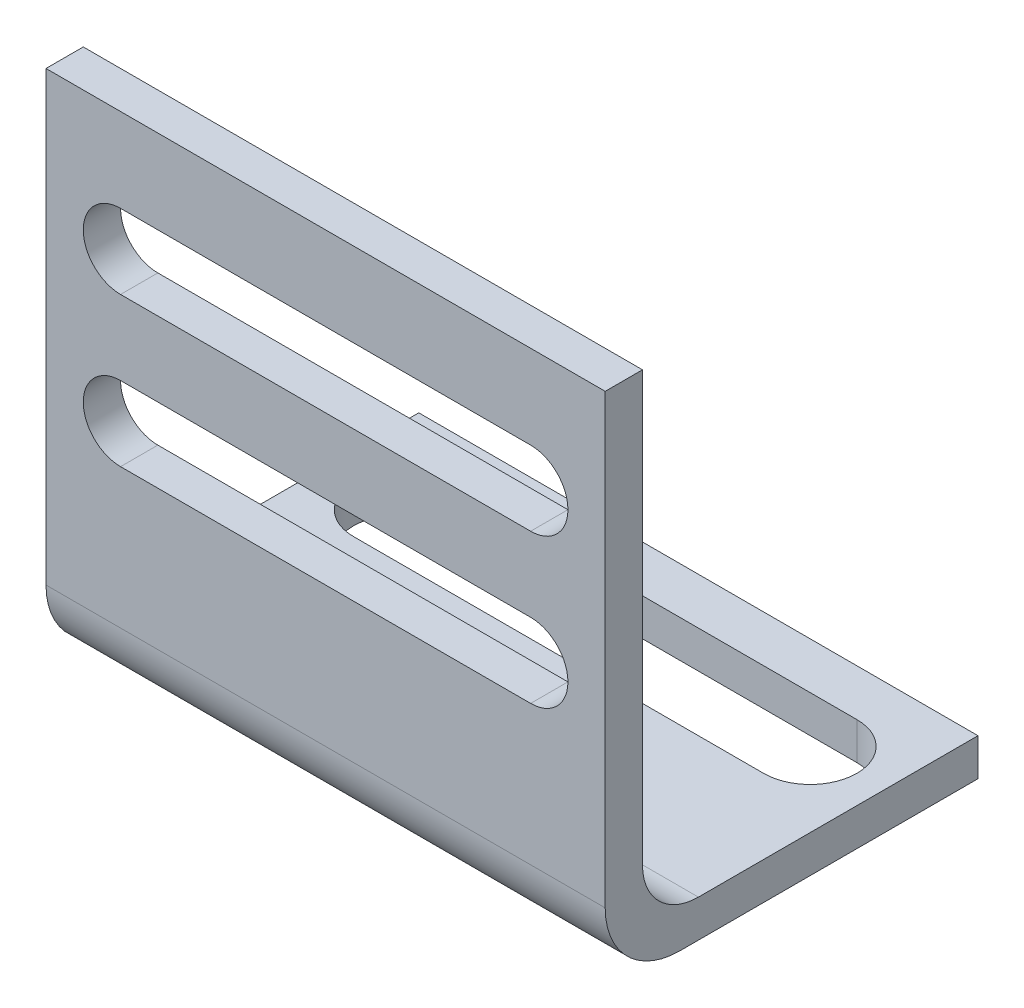
ISO-10303-21;
HEADER;
FILE_DESCRIPTION(('STEP AP214'),'2;1');
FILE_NAME('part.step','',(''),(''),'','','');
FILE_SCHEMA(('AUTOMOTIVE_DESIGN { 1 0 10303 214 1 1 1 1 }'));
ENDSEC;
DATA;
#1=APPLICATION_CONTEXT('core data for automotive mechanical design processes');
#2=APPLICATION_PROTOCOL_DEFINITION('international standard','automotive_design',2000,#1);
#3=PRODUCT_CONTEXT('',#1,'mechanical');
#4=PRODUCT('Part','Part','',(#3));
#5=PRODUCT_RELATED_PRODUCT_CATEGORY('part','',(#4));
#6=PRODUCT_DEFINITION_FORMATION('','',#4);
#7=PRODUCT_DEFINITION_CONTEXT('part definition',#1,'design');
#8=PRODUCT_DEFINITION('design','',#6,#7);
#9=PRODUCT_DEFINITION_SHAPE('','',#8);
#10=(LENGTH_UNIT() NAMED_UNIT(*) SI_UNIT(.MILLI.,.METRE.));
#11=(NAMED_UNIT(*) PLANE_ANGLE_UNIT() SI_UNIT($,.RADIAN.));
#12=(NAMED_UNIT(*) SI_UNIT($,.STERADIAN.) SOLID_ANGLE_UNIT());
#13=UNCERTAINTY_MEASURE_WITH_UNIT(LENGTH_MEASURE(1.E-05),#10,'distance_accuracy_value','');
#14=(GEOMETRIC_REPRESENTATION_CONTEXT(3) GLOBAL_UNCERTAINTY_ASSIGNED_CONTEXT((#13)) GLOBAL_UNIT_ASSIGNED_CONTEXT((#10,
#11,#12)) REPRESENTATION_CONTEXT('',''));
#15=CARTESIAN_POINT('',(0.,0.,0.));
#16=DIRECTION('',(0.,0.,1.));
#17=DIRECTION('',(1.,0.,0.));
#18=AXIS2_PLACEMENT_3D('',#15,#16,#17);
#19=CARTESIAN_POINT('',(30.,0.,0.));
#20=DIRECTION('',(0.,-1.,0.));
#21=DIRECTION('',(0.,0.,-1.));
#22=AXIS2_PLACEMENT_3D('',#19,#20,#21);
#23=PLANE('',#22);
#24=DIRECTION('',(0.,0.,1.));
#25=VECTOR('',#24,1.);
#26=CARTESIAN_POINT('',(0.,0.,0.));
#27=LINE('',#26,#25);
#28=CARTESIAN_POINT('',(0.,0.,-2.));
#29=VERTEX_POINT('',#28);
#30=CARTESIAN_POINT('',(0.,0.,0.));
#31=VERTEX_POINT('',#30);
#32=EDGE_CURVE('E239',#29,#31,#27,.T.);
#33=ORIENTED_EDGE('',*,*,#32,.T.);
#34=DIRECTION('',(-1.,0.,0.));
#35=VECTOR('',#34,1.);
#36=CARTESIAN_POINT('',(30.,0.,0.));
#37=LINE('',#36,#35);
#38=CARTESIAN_POINT('',(30.,0.,0.));
#39=VERTEX_POINT('',#38);
#40=EDGE_CURVE('E327',#39,#31,#37,.T.);
#41=ORIENTED_EDGE('',*,*,#40,.F.);
#42=DIRECTION('',(0.,0.,1.));
#43=VECTOR('',#42,1.);
#44=CARTESIAN_POINT('',(30.,0.,0.));
#45=LINE('',#44,#43);
#46=CARTESIAN_POINT('',(30.,0.,-2.));
#47=VERTEX_POINT('',#46);
#48=EDGE_CURVE('E275',#47,#39,#45,.T.);
#49=ORIENTED_EDGE('',*,*,#48,.F.);
#50=DIRECTION('',(-1.,0.,0.));
#51=VECTOR('',#50,1.);
#52=CARTESIAN_POINT('',(30.,0.,-2.));
#53=LINE('',#52,#51);
#54=EDGE_CURVE('E296',#47,#29,#53,.T.);
#55=ORIENTED_EDGE('',*,*,#54,.T.);
#56=EDGE_LOOP('',(#33,#41,#49,#55));
#57=FACE_BOUND('',#56,.T.);
#58=ADVANCED_FACE('F39',(#57),#23,.F.);
#59=CARTESIAN_POINT('',(30.,-17.4575433975545,0.));
#60=DIRECTION('',(0.,0.,-1.));
#61=DIRECTION('',(0.,1.,0.));
#62=AXIS2_PLACEMENT_3D('',#59,#60,#61);
#63=PLANE('',#62);
#64=DIRECTION('',(1.,0.,0.));
#65=VECTOR('',#64,1.);
#66=CARTESIAN_POINT('',(4.,-16.5,0.));
#67=LINE('',#66,#65);
#68=CARTESIAN_POINT('',(4.,-16.5,0.));
#69=VERTEX_POINT('',#68);
#70=CARTESIAN_POINT('',(26.,-16.5,0.));
#71=VERTEX_POINT('',#70);
#72=EDGE_CURVE('E222',#69,#71,#67,.T.);
#73=ORIENTED_EDGE('',*,*,#72,.F.);
#74=CARTESIAN_POINT('',(4.,-14.5,0.));
#75=DIRECTION('',(0.,0.,1.));
#76=DIRECTION('',(1.,0.,0.));
#77=AXIS2_PLACEMENT_3D('',#74,#75,#76);
#78=CIRCLE('',#77,2.);
#79=CARTESIAN_POINT('',(4.,-12.5,0.));
#80=VERTEX_POINT('',#79);
#81=EDGE_CURVE('E219',#80,#69,#78,.T.);
#82=ORIENTED_EDGE('',*,*,#81,.F.);
#83=DIRECTION('',(-1.,0.,0.));
#84=VECTOR('',#83,1.);
#85=CARTESIAN_POINT('',(4.,-12.5,0.));
#86=LINE('',#85,#84);
#87=CARTESIAN_POINT('',(26.,-12.5,0.));
#88=VERTEX_POINT('',#87);
#89=EDGE_CURVE('E231',#88,#80,#86,.T.);
#90=ORIENTED_EDGE('',*,*,#89,.F.);
#91=CARTESIAN_POINT('',(26.,-14.5,0.));
#92=DIRECTION('',(0.,0.,1.));
#93=DIRECTION('',(1.,0.,0.));
#94=AXIS2_PLACEMENT_3D('',#91,#92,#93);
#95=CIRCLE('',#94,2.);
#96=EDGE_CURVE('E227',#71,#88,#95,.T.);
#97=ORIENTED_EDGE('',*,*,#96,.F.);
#98=EDGE_LOOP('',(#73,#82,#90,#97));
#99=FACE_BOUND('',#98,.T.);
#100=DIRECTION('',(1.,0.,0.));
#101=VECTOR('',#100,1.);
#102=CARTESIAN_POINT('',(4.,-8.5,0.));
#103=LINE('',#102,#101);
#104=CARTESIAN_POINT('',(4.,-8.5,0.));
#105=VERTEX_POINT('',#104);
#106=CARTESIAN_POINT('',(26.,-8.5,0.));
#107=VERTEX_POINT('',#106);
#108=EDGE_CURVE('E251',#105,#107,#103,.T.);
#109=ORIENTED_EDGE('',*,*,#108,.F.);
#110=CARTESIAN_POINT('',(4.,-6.5,0.));
#111=DIRECTION('',(0.,0.,1.));
#112=DIRECTION('',(1.,0.,0.));
#113=AXIS2_PLACEMENT_3D('',#110,#111,#112);
#114=CIRCLE('',#113,2.);
#115=CARTESIAN_POINT('',(4.,-4.5,0.));
#116=VERTEX_POINT('',#115);
#117=EDGE_CURVE('E214',#116,#105,#114,.T.);
#118=ORIENTED_EDGE('',*,*,#117,.F.);
#119=DIRECTION('',(-1.,0.,0.));
#120=VECTOR('',#119,1.);
#121=CARTESIAN_POINT('',(4.,-4.5,0.));
#122=LINE('',#121,#120);
#123=CARTESIAN_POINT('',(26.,-4.5,0.));
#124=VERTEX_POINT('',#123);
#125=EDGE_CURVE('E259',#124,#116,#122,.T.);
#126=ORIENTED_EDGE('',*,*,#125,.F.);
#127=CARTESIAN_POINT('',(26.,-6.5,0.));
#128=DIRECTION('',(0.,0.,1.));
#129=DIRECTION('',(1.,0.,0.));
#130=AXIS2_PLACEMENT_3D('',#127,#128,#129);
#131=CIRCLE('',#130,2.);
#132=EDGE_CURVE('E255',#107,#124,#131,.T.);
#133=ORIENTED_EDGE('',*,*,#132,.F.);
#134=EDGE_LOOP('',(#109,#118,#126,#133));
#135=FACE_BOUND('',#134,.T.);
#136=DIRECTION('',(0.,-1.,0.));
#137=VECTOR('',#136,1.);
#138=CARTESIAN_POINT('',(0.,-17.4575433975545,0.));
#139=LINE('',#138,#137);
#140=CARTESIAN_POINT('',(0.,-24.,0.));
#141=VERTEX_POINT('',#140);
#142=EDGE_CURVE('E300',#31,#141,#139,.T.);
#143=ORIENTED_EDGE('',*,*,#142,.T.);
#144=DIRECTION('',(-1.,0.,0.));
#145=VECTOR('',#144,1.);
#146=CARTESIAN_POINT('',(30.,-24.,0.));
#147=LINE('',#146,#145);
#148=CARTESIAN_POINT('',(30.,-24.,0.));
#149=VERTEX_POINT('',#148);
#150=EDGE_CURVE('E383',#141,#149,#147,.F.);
#151=ORIENTED_EDGE('',*,*,#150,.T.);
#152=DIRECTION('',(0.,-1.,0.));
#153=VECTOR('',#152,1.);
#154=CARTESIAN_POINT('',(30.,0.,0.));
#155=LINE('',#154,#153);
#156=EDGE_CURVE('E279',#39,#149,#155,.T.);
#157=ORIENTED_EDGE('',*,*,#156,.F.);
#158=ORIENTED_EDGE('',*,*,#40,.T.);
#159=EDGE_LOOP('',(#143,#151,#157,#158));
#160=FACE_BOUND('',#159,.T.);
#161=ADVANCED_FACE('F418',(#99,#135,#160),#63,.F.);
#162=CARTESIAN_POINT('',(30.,-28.,-3.57604266858778));
#163=DIRECTION('',(0.,1.,0.));
#164=DIRECTION('',(0.,0.,1.));
#165=AXIS2_PLACEMENT_3D('',#162,#163,#164);
#166=PLANE('',#165);
#167=DIRECTION('',(1.,0.,0.));
#168=VECTOR('',#167,1.);
#169=CARTESIAN_POINT('',(4.,-28.,-17.5));
#170=LINE('',#169,#168);
#171=CARTESIAN_POINT('',(4.,-28.,-17.5));
#172=VERTEX_POINT('',#171);
#173=CARTESIAN_POINT('',(26.,-28.,-17.5));
#174=VERTEX_POINT('',#173);
#175=EDGE_CURVE('E193',#172,#174,#170,.T.);
#176=ORIENTED_EDGE('',*,*,#175,.F.);
#177=CARTESIAN_POINT('',(4.,-28.,-15.));
#178=DIRECTION('',(0.,-1.,0.));
#179=DIRECTION('',(0.,0.,-1.));
#180=AXIS2_PLACEMENT_3D('',#177,#178,#179);
#181=CIRCLE('',#180,2.5);
#182=CARTESIAN_POINT('',(4.,-28.,-12.5));
#183=VERTEX_POINT('',#182);
#184=EDGE_CURVE('E199',#183,#172,#181,.T.);
#185=ORIENTED_EDGE('',*,*,#184,.F.);
#186=DIRECTION('',(-1.,0.,0.));
#187=VECTOR('',#186,1.);
#188=CARTESIAN_POINT('',(4.,-28.,-12.5));
#189=LINE('',#188,#187);
#190=CARTESIAN_POINT('',(26.,-28.,-12.5));
#191=VERTEX_POINT('',#190);
#192=EDGE_CURVE('E204',#191,#183,#189,.T.);
#193=ORIENTED_EDGE('',*,*,#192,.F.);
#194=CARTESIAN_POINT('',(26.,-28.,-15.));
#195=DIRECTION('',(0.,-1.,0.));
#196=DIRECTION('',(0.,0.,-1.));
#197=AXIS2_PLACEMENT_3D('',#194,#195,#196);
#198=CIRCLE('',#197,2.5);
#199=EDGE_CURVE('E181',#174,#191,#198,.T.);
#200=ORIENTED_EDGE('',*,*,#199,.F.);
#201=EDGE_LOOP('',(#176,#185,#193,#200));
#202=FACE_BOUND('',#201,.T.);
#203=DIRECTION('',(0.,0.,-1.));
#204=VECTOR('',#203,1.);
#205=CARTESIAN_POINT('',(30.,-28.,0.));
#206=LINE('',#205,#204);
#207=CARTESIAN_POINT('',(30.,-28.,-4.));
#208=VERTEX_POINT('',#207);
#209=CARTESIAN_POINT('',(30.,-28.,-20.));
#210=VERTEX_POINT('',#209);
#211=EDGE_CURVE('E284',#208,#210,#206,.T.);
#212=ORIENTED_EDGE('',*,*,#211,.F.);
#213=DIRECTION('',(-1.,0.,0.));
#214=VECTOR('',#213,1.);
#215=CARTESIAN_POINT('',(30.,-28.,-4.));
#216=LINE('',#215,#214);
#217=CARTESIAN_POINT('',(0.,-28.,-4.));
#218=VERTEX_POINT('',#217);
#219=EDGE_CURVE('E376',#208,#218,#216,.T.);
#220=ORIENTED_EDGE('',*,*,#219,.T.);
#221=DIRECTION('',(0.,0.,-1.));
#222=VECTOR('',#221,1.);
#223=CARTESIAN_POINT('',(0.,-28.,-3.57604266858778));
#224=LINE('',#223,#222);
#225=CARTESIAN_POINT('',(0.,-28.,-20.));
#226=VERTEX_POINT('',#225);
#227=EDGE_CURVE('E304',#218,#226,#224,.T.);
#228=ORIENTED_EDGE('',*,*,#227,.T.);
#229=DIRECTION('',(-1.,0.,0.));
#230=VECTOR('',#229,1.);
#231=CARTESIAN_POINT('',(30.,-28.,-20.));
#232=LINE('',#231,#230);
#233=EDGE_CURVE('E323',#210,#226,#232,.T.);
#234=ORIENTED_EDGE('',*,*,#233,.F.);
#235=EDGE_LOOP('',(#212,#220,#228,#234));
#236=FACE_BOUND('',#235,.T.);
#237=ADVANCED_FACE('F201',(#202,#236),#166,.F.);
#238=CARTESIAN_POINT('',(30.,-26.,-20.));
#239=DIRECTION('',(0.,0.,1.));
#240=DIRECTION('',(1.,0.,0.));
#241=AXIS2_PLACEMENT_3D('',#238,#239,#240);
#242=PLANE('',#241);
#243=DIRECTION('',(0.,1.,0.));
#244=VECTOR('',#243,1.);
#245=CARTESIAN_POINT('',(0.,-26.,-20.));
#246=LINE('',#245,#244);
#247=CARTESIAN_POINT('',(0.,-26.,-20.));
#248=VERTEX_POINT('',#247);
#249=EDGE_CURVE('E307',#226,#248,#246,.T.);
#250=ORIENTED_EDGE('',*,*,#249,.T.);
#251=DIRECTION('',(-1.,0.,0.));
#252=VECTOR('',#251,1.);
#253=CARTESIAN_POINT('',(30.,-26.,-20.));
#254=LINE('',#253,#252);
#255=CARTESIAN_POINT('',(30.,-26.,-20.));
#256=VERTEX_POINT('',#255);
#257=EDGE_CURVE('E319',#256,#248,#254,.T.);
#258=ORIENTED_EDGE('',*,*,#257,.F.);
#259=DIRECTION('',(0.,1.,0.));
#260=VECTOR('',#259,1.);
#261=CARTESIAN_POINT('',(30.,-26.,-20.));
#262=LINE('',#261,#260);
#263=EDGE_CURVE('E287',#210,#256,#262,.T.);
#264=ORIENTED_EDGE('',*,*,#263,.F.);
#265=ORIENTED_EDGE('',*,*,#233,.T.);
#266=EDGE_LOOP('',(#250,#258,#264,#265));
#267=FACE_BOUND('',#266,.T.);
#268=ADVANCED_FACE('F428',(#267),#242,.F.);
#269=CARTESIAN_POINT('',(30.,-26.,-2.));
#270=DIRECTION('',(0.,-1.,0.));
#271=DIRECTION('',(0.,0.,-1.));
#272=AXIS2_PLACEMENT_3D('',#269,#270,#271);
#273=PLANE('',#272);
#274=DIRECTION('',(-1.,0.,0.));
#275=VECTOR('',#274,1.);
#276=CARTESIAN_POINT('',(30.,-26.,-12.5));
#277=LINE('',#276,#275);
#278=CARTESIAN_POINT('',(26.,-26.,-12.5));
#279=VERTEX_POINT('',#278);
#280=CARTESIAN_POINT('',(4.,-26.,-12.5));
#281=VERTEX_POINT('',#280);
#282=EDGE_CURVE('E368',#279,#281,#277,.T.);
#283=ORIENTED_EDGE('',*,*,#282,.T.);
#284=CARTESIAN_POINT('',(4.,-26.,-15.));
#285=DIRECTION('',(0.,-1.,0.));
#286=DIRECTION('',(0.,0.,-1.));
#287=AXIS2_PLACEMENT_3D('',#284,#285,#286);
#288=CIRCLE('',#287,2.5);
#289=CARTESIAN_POINT('',(4.,-26.,-17.5));
#290=VERTEX_POINT('',#289);
#291=EDGE_CURVE('E372',#281,#290,#288,.T.);
#292=ORIENTED_EDGE('',*,*,#291,.T.);
#293=DIRECTION('',(1.,0.,0.));
#294=VECTOR('',#293,1.);
#295=CARTESIAN_POINT('',(30.,-26.,-17.5));
#296=LINE('',#295,#294);
#297=CARTESIAN_POINT('',(26.,-26.,-17.5));
#298=VERTEX_POINT('',#297);
#299=EDGE_CURVE('E363',#290,#298,#296,.T.);
#300=ORIENTED_EDGE('',*,*,#299,.T.);
#301=CARTESIAN_POINT('',(26.,-26.,-15.));
#302=DIRECTION('',(0.,-1.,0.));
#303=DIRECTION('',(0.,0.,-1.));
#304=AXIS2_PLACEMENT_3D('',#301,#302,#303);
#305=CIRCLE('',#304,2.5);
#306=EDGE_CURVE('E184',#298,#279,#305,.T.);
#307=ORIENTED_EDGE('',*,*,#306,.T.);
#308=EDGE_LOOP('',(#283,#292,#300,#307));
#309=FACE_BOUND('',#308,.T.);
#310=DIRECTION('',(0.,0.,1.));
#311=VECTOR('',#310,1.);
#312=CARTESIAN_POINT('',(0.,-26.,-2.));
#313=LINE('',#312,#311);
#314=CARTESIAN_POINT('',(0.,-26.,-5.));
#315=VERTEX_POINT('',#314);
#316=EDGE_CURVE('E311',#248,#315,#313,.T.);
#317=ORIENTED_EDGE('',*,*,#316,.T.);
#318=DIRECTION('',(-1.,0.,0.));
#319=VECTOR('',#318,1.);
#320=CARTESIAN_POINT('',(30.,-26.,-5.));
#321=LINE('',#320,#319);
#322=CARTESIAN_POINT('',(30.,-26.,-5.));
#323=VERTEX_POINT('',#322);
#324=EDGE_CURVE('E55',#315,#323,#321,.F.);
#325=ORIENTED_EDGE('',*,*,#324,.T.);
#326=DIRECTION('',(0.,0.,1.));
#327=VECTOR('',#326,1.);
#328=CARTESIAN_POINT('',(30.,-26.,-3.74615988700237));
#329=LINE('',#328,#327);
#330=EDGE_CURVE('E290',#256,#323,#329,.T.);
#331=ORIENTED_EDGE('',*,*,#330,.F.);
#332=ORIENTED_EDGE('',*,*,#257,.T.);
#333=EDGE_LOOP('',(#317,#325,#331,#332));
#334=FACE_BOUND('',#333,.T.);
#335=ADVANCED_FACE('F431',(#309,#334),#273,.F.);
#336=CARTESIAN_POINT('',(30.,0.,-2.));
#337=DIRECTION('',(0.,0.,1.));
#338=DIRECTION('',(0.,-1.,0.));
#339=AXIS2_PLACEMENT_3D('',#336,#337,#338);
#340=PLANE('',#339);
#341=DIRECTION('',(-1.,0.,0.));
#342=VECTOR('',#341,1.);
#343=CARTESIAN_POINT('',(30.,-12.5,-2.));
#344=LINE('',#343,#342);
#345=CARTESIAN_POINT('',(26.,-12.5,-2.));
#346=VERTEX_POINT('',#345);
#347=CARTESIAN_POINT('',(4.,-12.5,-2.));
#348=VERTEX_POINT('',#347);
#349=EDGE_CURVE('E355',#346,#348,#344,.T.);
#350=ORIENTED_EDGE('',*,*,#349,.T.);
#351=CARTESIAN_POINT('',(4.,-14.5,-2.));
#352=DIRECTION('',(0.,0.,1.));
#353=DIRECTION('',(0.,-1.,0.));
#354=AXIS2_PLACEMENT_3D('',#351,#352,#353);
#355=CIRCLE('',#354,2.);
#356=CARTESIAN_POINT('',(4.,-16.5,-2.));
#357=VERTEX_POINT('',#356);
#358=EDGE_CURVE('E359',#348,#357,#355,.T.);
#359=ORIENTED_EDGE('',*,*,#358,.T.);
#360=DIRECTION('',(1.,0.,0.));
#361=VECTOR('',#360,1.);
#362=CARTESIAN_POINT('',(30.,-16.5,-2.));
#363=LINE('',#362,#361);
#364=CARTESIAN_POINT('',(26.,-16.5,-2.));
#365=VERTEX_POINT('',#364);
#366=EDGE_CURVE('E347',#357,#365,#363,.T.);
#367=ORIENTED_EDGE('',*,*,#366,.T.);
#368=CARTESIAN_POINT('',(26.,-14.5,-2.));
#369=DIRECTION('',(0.,0.,1.));
#370=DIRECTION('',(0.,-1.,0.));
#371=AXIS2_PLACEMENT_3D('',#368,#369,#370);
#372=CIRCLE('',#371,2.);
#373=EDGE_CURVE('E351',#365,#346,#372,.T.);
#374=ORIENTED_EDGE('',*,*,#373,.T.);
#375=EDGE_LOOP('',(#350,#359,#367,#374));
#376=FACE_BOUND('',#375,.T.);
#377=DIRECTION('',(-1.,0.,0.));
#378=VECTOR('',#377,1.);
#379=CARTESIAN_POINT('',(30.,-4.5,-2.));
#380=LINE('',#379,#378);
#381=CARTESIAN_POINT('',(26.,-4.5,-2.));
#382=VERTEX_POINT('',#381);
#383=CARTESIAN_POINT('',(4.,-4.5,-2.));
#384=VERTEX_POINT('',#383);
#385=EDGE_CURVE('E339',#382,#384,#380,.T.);
#386=ORIENTED_EDGE('',*,*,#385,.T.);
#387=CARTESIAN_POINT('',(4.,-6.5,-2.));
#388=DIRECTION('',(0.,0.,1.));
#389=DIRECTION('',(0.,-1.,0.));
#390=AXIS2_PLACEMENT_3D('',#387,#388,#389);
#391=CIRCLE('',#390,2.);
#392=CARTESIAN_POINT('',(4.,-8.5,-2.));
#393=VERTEX_POINT('',#392);
#394=EDGE_CURVE('E343',#384,#393,#391,.T.);
#395=ORIENTED_EDGE('',*,*,#394,.T.);
#396=DIRECTION('',(1.,0.,0.));
#397=VECTOR('',#396,1.);
#398=CARTESIAN_POINT('',(30.,-8.5,-2.));
#399=LINE('',#398,#397);
#400=CARTESIAN_POINT('',(26.,-8.5,-2.));
#401=VERTEX_POINT('',#400);
#402=EDGE_CURVE('E331',#393,#401,#399,.T.);
#403=ORIENTED_EDGE('',*,*,#402,.T.);
#404=CARTESIAN_POINT('',(26.,-6.5,-2.));
#405=DIRECTION('',(0.,0.,1.));
#406=DIRECTION('',(0.,-1.,0.));
#407=AXIS2_PLACEMENT_3D('',#404,#405,#406);
#408=CIRCLE('',#407,2.);
#409=EDGE_CURVE('E335',#401,#382,#408,.T.);
#410=ORIENTED_EDGE('',*,*,#409,.T.);
#411=EDGE_LOOP('',(#386,#395,#403,#410));
#412=FACE_BOUND('',#411,.T.);
#413=DIRECTION('',(0.,1.,0.));
#414=VECTOR('',#413,1.);
#415=CARTESIAN_POINT('',(30.,-18.3504856228447,-2.));
#416=LINE('',#415,#414);
#417=CARTESIAN_POINT('',(30.,-23.,-2.));
#418=VERTEX_POINT('',#417);
#419=EDGE_CURVE('E293',#418,#47,#416,.T.);
#420=ORIENTED_EDGE('',*,*,#419,.F.);
#421=DIRECTION('',(-1.,0.,0.));
#422=VECTOR('',#421,1.);
#423=CARTESIAN_POINT('',(0.,-23.,-2.));
#424=LINE('',#423,#422);
#425=CARTESIAN_POINT('',(0.,-23.,-2.));
#426=VERTEX_POINT('',#425);
#427=EDGE_CURVE('E389',#418,#426,#424,.T.);
#428=ORIENTED_EDGE('',*,*,#427,.T.);
#429=DIRECTION('',(0.,1.,0.));
#430=VECTOR('',#429,1.);
#431=CARTESIAN_POINT('',(0.,0.,-2.));
#432=LINE('',#431,#430);
#433=EDGE_CURVE('E280',#426,#29,#432,.T.);
#434=ORIENTED_EDGE('',*,*,#433,.T.);
#435=ORIENTED_EDGE('',*,*,#54,.F.);
#436=EDGE_LOOP('',(#420,#428,#434,#435));
#437=FACE_BOUND('',#436,.T.);
#438=ADVANCED_FACE('F398',(#376,#412,#437),#340,.F.);
#439=CARTESIAN_POINT('',(30.,0.,0.));
#440=DIRECTION('',(-1.,0.,0.));
#441=DIRECTION('',(0.,0.,1.));
#442=AXIS2_PLACEMENT_3D('',#439,#440,#441);
#443=PLANE('',#442);
#444=ORIENTED_EDGE('',*,*,#156,.T.);
#445=CARTESIAN_POINT('',(30.,-24.,-4.));
#446=DIRECTION('',(-1.,0.,0.));
#447=DIRECTION('',(0.,0.,1.));
#448=AXIS2_PLACEMENT_3D('',#445,#446,#447);
#449=CIRCLE('',#448,4.);
#450=EDGE_CURVE('E386',#149,#208,#449,.F.);
#451=ORIENTED_EDGE('',*,*,#450,.T.);
#452=ORIENTED_EDGE('',*,*,#211,.T.);
#453=ORIENTED_EDGE('',*,*,#263,.T.);
#454=ORIENTED_EDGE('',*,*,#330,.T.);
#455=CARTESIAN_POINT('',(30.,-23.,-5.));
#456=DIRECTION('',(-1.,0.,0.));
#457=DIRECTION('',(0.,0.,1.));
#458=AXIS2_PLACEMENT_3D('',#455,#456,#457);
#459=CIRCLE('',#458,3.);
#460=EDGE_CURVE('E11',#323,#418,#459,.T.);
#461=ORIENTED_EDGE('',*,*,#460,.T.);
#462=ORIENTED_EDGE('',*,*,#419,.T.);
#463=ORIENTED_EDGE('',*,*,#48,.T.);
#464=EDGE_LOOP('',(#444,#451,#452,#453,#454,#461,#462,#463));
#465=FACE_BOUND('',#464,.T.);
#466=ADVANCED_FACE('F409',(#465),#443,.F.);
#467=CARTESIAN_POINT('',(0.,0.,0.));
#468=DIRECTION('',(-1.,0.,0.));
#469=DIRECTION('',(0.,0.,1.));
#470=AXIS2_PLACEMENT_3D('',#467,#468,#469);
#471=PLANE('',#470);
#472=ORIENTED_EDGE('',*,*,#227,.F.);
#473=CARTESIAN_POINT('',(0.,-24.,-4.));
#474=DIRECTION('',(-1.,0.,0.));
#475=DIRECTION('',(0.,0.,1.));
#476=AXIS2_PLACEMENT_3D('',#473,#474,#475);
#477=CIRCLE('',#476,4.);
#478=EDGE_CURVE('E380',#218,#141,#477,.T.);
#479=ORIENTED_EDGE('',*,*,#478,.T.);
#480=ORIENTED_EDGE('',*,*,#142,.F.);
#481=ORIENTED_EDGE('',*,*,#32,.F.);
#482=ORIENTED_EDGE('',*,*,#433,.F.);
#483=CARTESIAN_POINT('',(0.,-23.,-5.));
#484=DIRECTION('',(-1.,0.,0.));
#485=DIRECTION('',(0.,0.,1.));
#486=AXIS2_PLACEMENT_3D('',#483,#484,#485);
#487=CIRCLE('',#486,3.);
#488=EDGE_CURVE('E48',#426,#315,#487,.F.);
#489=ORIENTED_EDGE('',*,*,#488,.T.);
#490=ORIENTED_EDGE('',*,*,#316,.F.);
#491=ORIENTED_EDGE('',*,*,#249,.F.);
#492=EDGE_LOOP('',(#472,#479,#480,#481,#482,#489,#490,#491));
#493=FACE_BOUND('',#492,.T.);
#494=ADVANCED_FACE('F404',(#493),#471,.T.);
#495=CARTESIAN_POINT('',(4.,-6.5,-20.));
#496=DIRECTION('',(0.,0.,1.));
#497=DIRECTION('',(1.,0.,0.));
#498=AXIS2_PLACEMENT_3D('',#495,#496,#497);
#499=CYLINDRICAL_SURFACE('',#498,2.);
#500=DIRECTION('',(0.,0.,1.));
#501=VECTOR('',#500,1.);
#502=CARTESIAN_POINT('',(4.,-4.5,-20.));
#503=LINE('',#502,#501);
#504=EDGE_CURVE('E223',#384,#116,#503,.T.);
#505=ORIENTED_EDGE('',*,*,#504,.T.);
#506=ORIENTED_EDGE('',*,*,#117,.T.);
#507=DIRECTION('',(0.,0.,1.));
#508=VECTOR('',#507,1.);
#509=CARTESIAN_POINT('',(4.,-8.5,-20.));
#510=LINE('',#509,#508);
#511=EDGE_CURVE('E263',#393,#105,#510,.T.);
#512=ORIENTED_EDGE('',*,*,#511,.F.);
#513=ORIENTED_EDGE('',*,*,#394,.F.);
#514=EDGE_LOOP('',(#505,#506,#512,#513));
#515=FACE_BOUND('',#514,.T.);
#516=ADVANCED_FACE('F441',(#515),#499,.F.);
#517=CARTESIAN_POINT('',(4.,-4.5,-20.));
#518=DIRECTION('',(0.,1.,0.));
#519=DIRECTION('',(0.,0.,1.));
#520=AXIS2_PLACEMENT_3D('',#517,#518,#519);
#521=PLANE('',#520);
#522=DIRECTION('',(0.,0.,1.));
#523=VECTOR('',#522,1.);
#524=CARTESIAN_POINT('',(26.,-4.5,-20.));
#525=LINE('',#524,#523);
#526=EDGE_CURVE('E266',#382,#124,#525,.T.);
#527=ORIENTED_EDGE('',*,*,#526,.T.);
#528=ORIENTED_EDGE('',*,*,#125,.T.);
#529=ORIENTED_EDGE('',*,*,#504,.F.);
#530=ORIENTED_EDGE('',*,*,#385,.F.);
#531=EDGE_LOOP('',(#527,#528,#529,#530));
#532=FACE_BOUND('',#531,.T.);
#533=ADVANCED_FACE('F446',(#532),#521,.F.);
#534=CARTESIAN_POINT('',(26.,-6.5,-20.));
#535=DIRECTION('',(0.,0.,1.));
#536=DIRECTION('',(1.,0.,0.));
#537=AXIS2_PLACEMENT_3D('',#534,#535,#536);
#538=CYLINDRICAL_SURFACE('',#537,2.);
#539=DIRECTION('',(0.,0.,1.));
#540=VECTOR('',#539,1.);
#541=CARTESIAN_POINT('',(26.,-8.5,-20.));
#542=LINE('',#541,#540);
#543=EDGE_CURVE('E269',#401,#107,#542,.T.);
#544=ORIENTED_EDGE('',*,*,#543,.T.);
#545=ORIENTED_EDGE('',*,*,#132,.T.);
#546=ORIENTED_EDGE('',*,*,#526,.F.);
#547=ORIENTED_EDGE('',*,*,#409,.F.);
#548=EDGE_LOOP('',(#544,#545,#546,#547));
#549=FACE_BOUND('',#548,.T.);
#550=ADVANCED_FACE('F452',(#549),#538,.F.);
#551=CARTESIAN_POINT('',(4.,-8.5,-20.));
#552=DIRECTION('',(0.,-1.,0.));
#553=DIRECTION('',(0.,0.,-1.));
#554=AXIS2_PLACEMENT_3D('',#551,#552,#553);
#555=PLANE('',#554);
#556=ORIENTED_EDGE('',*,*,#511,.T.);
#557=ORIENTED_EDGE('',*,*,#108,.T.);
#558=ORIENTED_EDGE('',*,*,#543,.F.);
#559=ORIENTED_EDGE('',*,*,#402,.F.);
#560=EDGE_LOOP('',(#556,#557,#558,#559));
#561=FACE_BOUND('',#560,.T.);
#562=ADVANCED_FACE('F448',(#561),#555,.F.);
#563=CARTESIAN_POINT('',(4.,-14.5,-20.));
#564=DIRECTION('',(0.,0.,1.));
#565=DIRECTION('',(1.,0.,0.));
#566=AXIS2_PLACEMENT_3D('',#563,#564,#565);
#567=CYLINDRICAL_SURFACE('',#566,2.);
#568=DIRECTION('',(0.,0.,1.));
#569=VECTOR('',#568,1.);
#570=CARTESIAN_POINT('',(4.,-12.5,-20.));
#571=LINE('',#570,#569);
#572=EDGE_CURVE('E236',#348,#80,#571,.T.);
#573=ORIENTED_EDGE('',*,*,#572,.T.);
#574=ORIENTED_EDGE('',*,*,#81,.T.);
#575=DIRECTION('',(0.,0.,1.));
#576=VECTOR('',#575,1.);
#577=CARTESIAN_POINT('',(4.,-16.5,-20.));
#578=LINE('',#577,#576);
#579=EDGE_CURVE('E235',#357,#69,#578,.T.);
#580=ORIENTED_EDGE('',*,*,#579,.F.);
#581=ORIENTED_EDGE('',*,*,#358,.F.);
#582=EDGE_LOOP('',(#573,#574,#580,#581));
#583=FACE_BOUND('',#582,.T.);
#584=ADVANCED_FACE('F451',(#583),#567,.F.);
#585=CARTESIAN_POINT('',(4.,-12.5,-20.));
#586=DIRECTION('',(0.,1.,0.));
#587=DIRECTION('',(0.,0.,1.));
#588=AXIS2_PLACEMENT_3D('',#585,#586,#587);
#589=PLANE('',#588);
#590=DIRECTION('',(0.,0.,1.));
#591=VECTOR('',#590,1.);
#592=CARTESIAN_POINT('',(26.,-12.5,-20.));
#593=LINE('',#592,#591);
#594=EDGE_CURVE('E240',#346,#88,#593,.T.);
#595=ORIENTED_EDGE('',*,*,#594,.T.);
#596=ORIENTED_EDGE('',*,*,#89,.T.);
#597=ORIENTED_EDGE('',*,*,#572,.F.);
#598=ORIENTED_EDGE('',*,*,#349,.F.);
#599=EDGE_LOOP('',(#595,#596,#597,#598));
#600=FACE_BOUND('',#599,.T.);
#601=ADVANCED_FACE('F462',(#600),#589,.F.);
#602=CARTESIAN_POINT('',(26.,-14.5,-20.));
#603=DIRECTION('',(0.,0.,1.));
#604=DIRECTION('',(1.,0.,0.));
#605=AXIS2_PLACEMENT_3D('',#602,#603,#604);
#606=CYLINDRICAL_SURFACE('',#605,2.);
#607=DIRECTION('',(0.,0.,1.));
#608=VECTOR('',#607,1.);
#609=CARTESIAN_POINT('',(26.,-16.5,-20.));
#610=LINE('',#609,#608);
#611=EDGE_CURVE('E243',#365,#71,#610,.T.);
#612=ORIENTED_EDGE('',*,*,#611,.T.);
#613=ORIENTED_EDGE('',*,*,#96,.T.);
#614=ORIENTED_EDGE('',*,*,#594,.F.);
#615=ORIENTED_EDGE('',*,*,#373,.F.);
#616=EDGE_LOOP('',(#612,#613,#614,#615));
#617=FACE_BOUND('',#616,.T.);
#618=ADVANCED_FACE('F468',(#617),#606,.F.);
#619=CARTESIAN_POINT('',(4.,-16.5,-20.));
#620=DIRECTION('',(0.,-1.,0.));
#621=DIRECTION('',(0.,0.,-1.));
#622=AXIS2_PLACEMENT_3D('',#619,#620,#621);
#623=PLANE('',#622);
#624=ORIENTED_EDGE('',*,*,#579,.T.);
#625=ORIENTED_EDGE('',*,*,#72,.T.);
#626=ORIENTED_EDGE('',*,*,#611,.F.);
#627=ORIENTED_EDGE('',*,*,#366,.F.);
#628=EDGE_LOOP('',(#624,#625,#626,#627));
#629=FACE_BOUND('',#628,.T.);
#630=ADVANCED_FACE('F464',(#629),#623,.F.);
#631=CARTESIAN_POINT('',(4.,0.,-15.));
#632=DIRECTION('',(0.,-1.,0.));
#633=DIRECTION('',(0.,0.,-1.));
#634=AXIS2_PLACEMENT_3D('',#631,#632,#633);
#635=CYLINDRICAL_SURFACE('',#634,2.5);
#636=DIRECTION('',(0.,-1.,0.));
#637=VECTOR('',#636,1.);
#638=CARTESIAN_POINT('',(4.,0.,-12.5));
#639=LINE('',#638,#637);
#640=EDGE_CURVE('E211',#281,#183,#639,.T.);
#641=ORIENTED_EDGE('',*,*,#640,.T.);
#642=ORIENTED_EDGE('',*,*,#184,.T.);
#643=DIRECTION('',(0.,-1.,0.));
#644=VECTOR('',#643,1.);
#645=CARTESIAN_POINT('',(4.,0.,-17.5));
#646=LINE('',#645,#644);
#647=EDGE_CURVE('E189',#290,#172,#646,.T.);
#648=ORIENTED_EDGE('',*,*,#647,.F.);
#649=ORIENTED_EDGE('',*,*,#291,.F.);
#650=EDGE_LOOP('',(#641,#642,#648,#649));
#651=FACE_BOUND('',#650,.T.);
#652=ADVANCED_FACE('F467',(#651),#635,.F.);
#653=CARTESIAN_POINT('',(4.,0.,-12.5));
#654=DIRECTION('',(0.,0.,1.));
#655=DIRECTION('',(1.,0.,0.));
#656=AXIS2_PLACEMENT_3D('',#653,#654,#655);
#657=PLANE('',#656);
#658=DIRECTION('',(0.,-1.,0.));
#659=VECTOR('',#658,1.);
#660=CARTESIAN_POINT('',(26.,0.,-12.5));
#661=LINE('',#660,#659);
#662=EDGE_CURVE('E188',#279,#191,#661,.T.);
#663=ORIENTED_EDGE('',*,*,#662,.T.);
#664=ORIENTED_EDGE('',*,*,#192,.T.);
#665=ORIENTED_EDGE('',*,*,#640,.F.);
#666=ORIENTED_EDGE('',*,*,#282,.F.);
#667=EDGE_LOOP('',(#663,#664,#665,#666));
#668=FACE_BOUND('',#667,.T.);
#669=ADVANCED_FACE('F478',(#668),#657,.F.);
#670=CARTESIAN_POINT('',(26.,0.,-15.));
#671=DIRECTION('',(0.,-1.,0.));
#672=DIRECTION('',(0.,0.,-1.));
#673=AXIS2_PLACEMENT_3D('',#670,#671,#672);
#674=CYLINDRICAL_SURFACE('',#673,2.5);
#675=DIRECTION('',(0.,-1.,0.));
#676=VECTOR('',#675,1.);
#677=CARTESIAN_POINT('',(26.,0.,-17.5));
#678=LINE('',#677,#676);
#679=EDGE_CURVE('E176',#298,#174,#678,.T.);
#680=ORIENTED_EDGE('',*,*,#679,.T.);
#681=ORIENTED_EDGE('',*,*,#199,.T.);
#682=ORIENTED_EDGE('',*,*,#662,.F.);
#683=ORIENTED_EDGE('',*,*,#306,.F.);
#684=EDGE_LOOP('',(#680,#681,#682,#683));
#685=FACE_BOUND('',#684,.T.);
#686=ADVANCED_FACE('F178',(#685),#674,.F.);
#687=CARTESIAN_POINT('',(4.,0.,-17.5));
#688=DIRECTION('',(0.,0.,-1.));
#689=DIRECTION('',(-1.,0.,0.));
#690=AXIS2_PLACEMENT_3D('',#687,#688,#689);
#691=PLANE('',#690);
#692=ORIENTED_EDGE('',*,*,#647,.T.);
#693=ORIENTED_EDGE('',*,*,#175,.T.);
#694=ORIENTED_EDGE('',*,*,#679,.F.);
#695=ORIENTED_EDGE('',*,*,#299,.F.);
#696=EDGE_LOOP('',(#692,#693,#694,#695));
#697=FACE_BOUND('',#696,.T.);
#698=ADVANCED_FACE('F194',(#697),#691,.F.);
#699=CARTESIAN_POINT('',(30.,-24.,-4.));
#700=DIRECTION('',(-1.,0.,0.));
#701=DIRECTION('',(0.,0.,1.));
#702=AXIS2_PLACEMENT_3D('',#699,#700,#701);
#703=CYLINDRICAL_SURFACE('',#702,4.);
#704=ORIENTED_EDGE('',*,*,#450,.F.);
#705=ORIENTED_EDGE('',*,*,#150,.F.);
#706=ORIENTED_EDGE('',*,*,#478,.F.);
#707=ORIENTED_EDGE('',*,*,#219,.F.);
#708=EDGE_LOOP('',(#704,#705,#706,#707));
#709=FACE_BOUND('',#708,.T.);
#710=ADVANCED_FACE('F412',(#709),#703,.T.);
#711=CARTESIAN_POINT('',(30.,-23.,-5.));
#712=DIRECTION('',(1.,0.,0.));
#713=DIRECTION('',(0.,0.,-1.));
#714=AXIS2_PLACEMENT_3D('',#711,#712,#713);
#715=CYLINDRICAL_SURFACE('',#714,3.);
#716=ORIENTED_EDGE('',*,*,#460,.F.);
#717=ORIENTED_EDGE('',*,*,#324,.F.);
#718=ORIENTED_EDGE('',*,*,#488,.F.);
#719=ORIENTED_EDGE('',*,*,#427,.F.);
#720=EDGE_LOOP('',(#716,#717,#718,#719));
#721=FACE_BOUND('',#720,.T.);
#722=ADVANCED_FACE('F41',(#721),#715,.F.);
#723=CLOSED_SHELL('',(#58,#161,#237,#268,#335,#438,#466,#494,#516,#533,#550,#562,#584,#601,#618,
#630,#652,#669,#686,#698,#710,#722));
#724=MANIFOLD_SOLID_BREP('B2',#723);
#725=ADVANCED_BREP_SHAPE_REPRESENTATION('',(#18,#724),#14);
#726=SHAPE_DEFINITION_REPRESENTATION(#9,#725);
ENDSEC;
END-ISO-10303-21;
